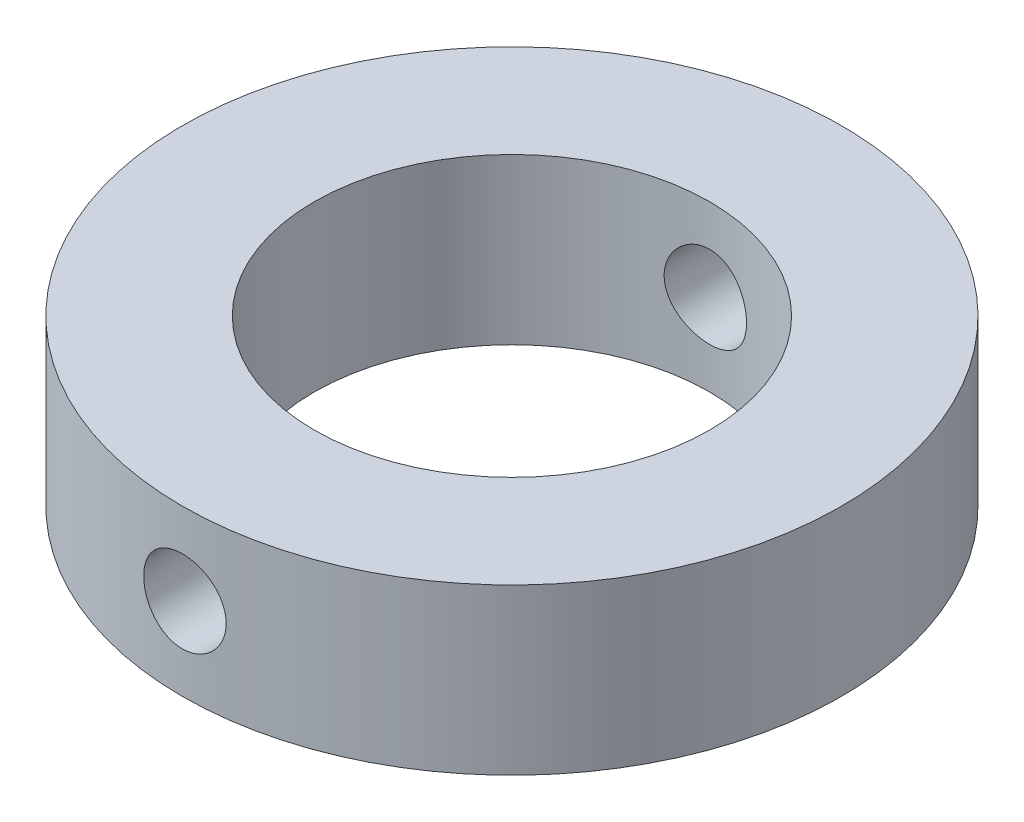
ISO-10303-21;
HEADER;
FILE_DESCRIPTION(('STEP AP214'),'2;1');
FILE_NAME('part.step','',(''),(''),'','','');
FILE_SCHEMA(('AUTOMOTIVE_DESIGN { 1 0 10303 214 1 1 1 1 }'));
ENDSEC;
DATA;
#1=APPLICATION_CONTEXT('core data for automotive mechanical design processes');
#2=APPLICATION_PROTOCOL_DEFINITION('international standard','automotive_design',2000,#1);
#3=PRODUCT_CONTEXT('',#1,'mechanical');
#4=PRODUCT('Part','Part','',(#3));
#5=PRODUCT_RELATED_PRODUCT_CATEGORY('part','',(#4));
#6=PRODUCT_DEFINITION_FORMATION('','',#4);
#7=PRODUCT_DEFINITION_CONTEXT('part definition',#1,'design');
#8=PRODUCT_DEFINITION('design','',#6,#7);
#9=PRODUCT_DEFINITION_SHAPE('','',#8);
#10=(LENGTH_UNIT() NAMED_UNIT(*) SI_UNIT(.MILLI.,.METRE.));
#11=(NAMED_UNIT(*) PLANE_ANGLE_UNIT() SI_UNIT($,.RADIAN.));
#12=(NAMED_UNIT(*) SI_UNIT($,.STERADIAN.) SOLID_ANGLE_UNIT());
#13=UNCERTAINTY_MEASURE_WITH_UNIT(LENGTH_MEASURE(1.E-05),#10,'distance_accuracy_value','');
#14=(GEOMETRIC_REPRESENTATION_CONTEXT(3) GLOBAL_UNCERTAINTY_ASSIGNED_CONTEXT((#13)) GLOBAL_UNIT_ASSIGNED_CONTEXT((#10,
#11,#12)) REPRESENTATION_CONTEXT('',''));
#15=CARTESIAN_POINT('',(0.,0.,0.));
#16=DIRECTION('',(0.,0.,1.));
#17=DIRECTION('',(1.,0.,0.));
#18=AXIS2_PLACEMENT_3D('',#15,#16,#17);
#19=CARTESIAN_POINT('',(0.,5.,0.));
#20=DIRECTION('',(0.,1.,0.));
#21=DIRECTION('',(0.,0.,1.));
#22=AXIS2_PLACEMENT_3D('',#19,#20,#21);
#23=PLANE('',#22);
#24=CARTESIAN_POINT('',(0.,5.,0.));
#25=DIRECTION('',(0.,1.,0.));
#26=DIRECTION('',(0.,0.,1.));
#27=AXIS2_PLACEMENT_3D('',#24,#25,#26);
#28=CIRCLE('',#27,10.);
#29=CARTESIAN_POINT('',(0.,5.,10.));
#30=VERTEX_POINT('',#29);
#31=EDGE_CURVE('E10',#30,#30,#28,.T.);
#32=ORIENTED_EDGE('',*,*,#31,.T.);
#33=EDGE_LOOP('',(#32));
#34=FACE_BOUND('',#33,.T.);
#35=CARTESIAN_POINT('',(0.,5.,0.));
#36=DIRECTION('',(0.,1.,0.));
#37=DIRECTION('',(0.,0.,1.));
#38=AXIS2_PLACEMENT_3D('',#35,#36,#37);
#39=CIRCLE('',#38,6.);
#40=CARTESIAN_POINT('',(0.,5.,6.));
#41=VERTEX_POINT('',#40);
#42=EDGE_CURVE('E50',#41,#41,#39,.T.);
#43=ORIENTED_EDGE('',*,*,#42,.F.);
#44=EDGE_LOOP('',(#43));
#45=FACE_BOUND('',#44,.T.);
#46=ADVANCED_FACE('F32',(#34,#45),#23,.T.);
#47=CARTESIAN_POINT('',(0.,0.,0.));
#48=DIRECTION('',(0.,1.,0.));
#49=DIRECTION('',(0.,0.,1.));
#50=AXIS2_PLACEMENT_3D('',#47,#48,#49);
#51=PLANE('',#50);
#52=CARTESIAN_POINT('',(0.,0.,0.));
#53=DIRECTION('',(0.,1.,0.));
#54=DIRECTION('',(0.,0.,1.));
#55=AXIS2_PLACEMENT_3D('',#52,#53,#54);
#56=CIRCLE('',#55,10.);
#57=CARTESIAN_POINT('',(0.,0.,10.));
#58=VERTEX_POINT('',#57);
#59=EDGE_CURVE('E45',#58,#58,#56,.T.);
#60=ORIENTED_EDGE('',*,*,#59,.F.);
#61=EDGE_LOOP('',(#60));
#62=FACE_BOUND('',#61,.T.);
#63=CARTESIAN_POINT('',(0.,0.,0.));
#64=DIRECTION('',(0.,1.,0.));
#65=DIRECTION('',(0.,0.,1.));
#66=AXIS2_PLACEMENT_3D('',#63,#64,#65);
#67=CIRCLE('',#66,6.);
#68=CARTESIAN_POINT('',(0.,0.,6.));
#69=VERTEX_POINT('',#68);
#70=EDGE_CURVE('E53',#69,#69,#67,.T.);
#71=ORIENTED_EDGE('',*,*,#70,.T.);
#72=EDGE_LOOP('',(#71));
#73=FACE_BOUND('',#72,.T.);
#74=ADVANCED_FACE('F86',(#62,#73),#51,.F.);
#75=CARTESIAN_POINT('',(0.,5.,0.));
#76=DIRECTION('',(0.,-1.,0.));
#77=DIRECTION('',(0.,0.,-1.));
#78=AXIS2_PLACEMENT_3D('',#75,#76,#77);
#79=CYLINDRICAL_SURFACE('',#78,10.);
#80=CARTESIAN_POINT('',(0.,3.75,-10.));
#81=CARTESIAN_POINT('',(-0.0699205477778807,3.74999702953214,-9.99999902448214));
#82=CARTESIAN_POINT('',(-0.139884787151374,3.74411356041536,-9.99925892277451));
#83=CARTESIAN_POINT('',(-0.277866401044876,3.7207361227146,-9.9963777005568));
#84=CARTESIAN_POINT('',(-0.345881665311872,3.70323003103831,-9.99423511720715));
#85=CARTESIAN_POINT('',(-0.477947787406527,3.65713117804296,-9.98879030522203));
#86=CARTESIAN_POINT('',(-0.542001280073069,3.62854587909507,-9.98548885727771));
#87=CARTESIAN_POINT('',(-0.664389737446518,3.5611163580151,-9.97809350439049));
#88=CARTESIAN_POINT('',(-0.722725680778185,3.52227389573464,-9.97399973542058));
#89=CARTESIAN_POINT('',(-0.832356408465658,3.4352040250802,-9.96545160653163));
#90=CARTESIAN_POINT('',(-0.883615182468563,3.38693143532688,-9.96099557346208));
#91=CARTESIAN_POINT('',(-0.977326396778747,3.28246858823168,-9.95223863004875));
#92=CARTESIAN_POINT('',(-1.01977838819613,3.22627792754338,-9.94793772762134));
#93=CARTESIAN_POINT('',(-1.09480508064197,3.10734001121717,-9.93996152809792));
#94=CARTESIAN_POINT('',(-1.12734604797054,3.04457131921603,-9.93628838588955));
#95=CARTESIAN_POINT('',(-1.18141153828756,2.91440647402632,-9.93000564228841));
#96=CARTESIAN_POINT('',(-1.20293647903261,2.84701049642649,-9.92739600056568));
#97=CARTESIAN_POINT('',(-1.23424949001238,2.70987790220662,-9.92355169801807));
#98=CARTESIAN_POINT('',(-1.24409835736585,2.6401553711479,-9.92230991718372));
#99=CARTESIAN_POINT('',(-1.25196777477861,2.50003686826408,-9.92132014071396));
#100=CARTESIAN_POINT('',(-1.24998880050121,2.42964092363435,-9.92157208500754));
#101=CARTESIAN_POINT('',(-1.23430861822395,2.29059758637561,-9.92353477684876));
#102=CARTESIAN_POINT('',(-1.22067438149235,2.22194250689987,-9.92523718980164));
#103=CARTESIAN_POINT('',(-1.18217519159103,2.08790248939051,-9.92989599878814));
#104=CARTESIAN_POINT('',(-1.15731001087595,2.02251761764298,-9.93285242022862));
#105=CARTESIAN_POINT('',(-1.09698277995582,1.89666600048916,-9.93969557932326));
#106=CARTESIAN_POINT('',(-1.06149162685382,1.83621334987551,-9.94358486605722));
#107=CARTESIAN_POINT('',(-0.980940734728459,1.72209665279338,-9.95185355715299));
#108=CARTESIAN_POINT('',(-0.935880558040388,1.66843291701316,-9.95623298392831));
#109=CARTESIAN_POINT('',(-0.83709955537689,1.56902864463863,-9.96502554945212));
#110=CARTESIAN_POINT('',(-0.783321003920006,1.52334545411701,-9.96943871193445));
#111=CARTESIAN_POINT('',(-0.668828584556961,1.44164555998473,-9.97777316277926));
#112=CARTESIAN_POINT('',(-0.608114700659126,1.405628878664,-9.98169445000753));
#113=CARTESIAN_POINT('',(-0.48143083568174,1.34428433976804,-9.9886057610929));
#114=CARTESIAN_POINT('',(-0.415459097668858,1.31896007305939,-9.99159547200768));
#115=CARTESIAN_POINT('',(-0.280153970215528,1.27976475323837,-9.99630392890031));
#116=CARTESIAN_POINT('',(-0.210820738315333,1.26589316393147,-9.99802273437935));
#117=CARTESIAN_POINT('',(-0.0712565819567485,1.25007128786972,-9.9999879820538));
#118=CARTESIAN_POINT('',(-0.00103474509930337,1.24804200381796,-10.0002441807132));
#119=CARTESIAN_POINT('',(0.138748018248748,1.25575386702797,-9.99928169002715));
#120=CARTESIAN_POINT('',(0.208308958782353,1.2654947636258,-9.99806303209106));
#121=CARTESIAN_POINT('',(0.344562253860761,1.29640485438719,-9.99429384378346));
#122=CARTESIAN_POINT('',(0.411263285212353,1.31753638170132,-9.99174770406934));
#123=CARTESIAN_POINT('',(0.540174827429204,1.37058872595646,-9.98560861550098));
#124=CARTESIAN_POINT('',(0.602385185732658,1.40250990924571,-9.98201563110312));
#125=CARTESIAN_POINT('',(0.720902260343714,1.47642656875373,-9.97415911455056));
#126=CARTESIAN_POINT('',(0.77717687997191,1.51847314490282,-9.96989222021254));
#127=CARTESIAN_POINT('',(0.881898494813159,1.6113747487671,-9.96117571162828));
#128=CARTESIAN_POINT('',(0.930345179168429,1.6622301261255,-9.95672609013449));
#129=CARTESIAN_POINT('',(1.01831597940901,1.77165370837857,-9.94811552731292));
#130=CARTESIAN_POINT('',(1.05778773028397,1.8302641731552,-9.94395637360663));
#131=CARTESIAN_POINT('',(1.12632644472175,1.95332912242736,-9.93642705518574));
#132=CARTESIAN_POINT('',(1.15539361686418,2.01778348973826,-9.93305687465513));
#133=CARTESIAN_POINT('',(1.20221328943327,2.15053765957381,-9.92749925196498));
#134=CARTESIAN_POINT('',(1.21999531372855,2.21882691502399,-9.92530872592394));
#135=CARTESIAN_POINT('',(1.24383499693392,2.35745124189033,-9.92234957953727));
#136=CARTESIAN_POINT('',(1.24989320126788,2.4277862179795,-9.92158089304388));
#137=CARTESIAN_POINT('',(1.25010326804242,2.56798446460234,-9.92155438491228));
#138=CARTESIAN_POINT('',(1.24433739884964,2.63784762416594,-9.92228612375977));
#139=CARTESIAN_POINT('',(1.22123720242466,2.77560356467254,-9.925155572686));
#140=CARTESIAN_POINT('',(1.20390287395288,2.8434963454044,-9.92729328291541));
#141=CARTESIAN_POINT('',(1.15818353684483,2.9753734783832,-9.93273057887275));
#142=CARTESIAN_POINT('',(1.12980249048547,3.03935922251091,-9.93602974796392));
#143=CARTESIAN_POINT('',(1.06280345107515,3.16167332702416,-9.9434189162241));
#144=CARTESIAN_POINT('',(1.02418532975479,3.22000161650991,-9.94750892530207));
#145=CARTESIAN_POINT('',(0.937503165632919,3.32976561267024,-9.95605302376117));
#146=CARTESIAN_POINT('',(0.889377812887479,3.38115273047749,-9.96050936042016));
#147=CARTESIAN_POINT('',(0.785175113484191,3.47515341258399,-9.9692641579645));
#148=CARTESIAN_POINT('',(0.729095894570784,3.51776490538716,-9.97356258137795));
#149=CARTESIAN_POINT('',(0.610332810427105,3.59314267855265,-9.98153528293373));
#150=CARTESIAN_POINT('',(0.547624639798084,3.62587090294963,-9.9852071253915));
#151=CARTESIAN_POINT('',(0.41759145115064,3.68028562145814,-9.99148824538362));
#152=CARTESIAN_POINT('',(0.350271540435118,3.70198411317673,-9.99409867684788));
#153=CARTESIAN_POINT('',(0.235502885983962,3.72852966908565,-9.99733360163873));
#154=CARTESIAN_POINT('',(0.18877783175846,3.73656947099103,-9.99832862947727));
#155=CARTESIAN_POINT('',(0.0947085316062171,3.74730562284661,-9.99966215664594));
#156=CARTESIAN_POINT('',(0.0473642902480135,3.75000201219965,-10.0000006608173));
#157=CARTESIAN_POINT('',(0.,3.75,-10.));
#158=B_SPLINE_CURVE_WITH_KNOTS('',3,(#80,#81,#82,#83,#84,#85,#86,#87,#88,#89,#90,#91,#92,#93,
#94,#95,#96,#97,#98,#99,#100,#101,#102,#103,#104,#105,#106,#107,#108,#109,#110,#111,#112,#113,
#114,#115,#116,#117,#118,#119,#120,#121,#122,#123,#124,#125,#126,#127,#128,#129,#130,#131,#132,
#133,#134,#135,#136,#137,#138,#139,#140,#141,#142,#143,#144,#145,#146,#147,#148,#149,#150,#151,
#152,#153,#154,#155,#156,#157),.UNSPECIFIED.,.T.,.F.,(4,2,2,2,2,2,2,2,2,2,2,2,2,2,2,2,2,2,2,2,2,
2,2,2,2,2,2,2,2,2,2,2,2,2,2,2,2,2,4),(0.,0.209588636388124,0.419396230471713,0.629062754090885,
0.838693327955366,1.04935406600922,1.26002553900005,1.47140625159435,1.68277894748403,
1.8930461264316,2.10330484942332,2.31236348220846,2.52142635083121,2.73106713142767,
2.94071750256819,3.15181739068208,3.36291776556557,3.57408897865803,3.7852503045189,
3.99500139695961,4.20474802250965,4.41380526946698,4.62286961539474,4.83301201464211,
5.04316275687544,5.25450985753787,5.4658527211077,5.67664037140463,5.88741821505312,
6.09673450601108,6.30605081939774,6.51529212353244,6.72453604956132,6.93517618845915,
7.14586599235007,7.35735701518427,7.56861749342017,7.71059421593815,7.85256989150219),.UNSPECIFIED.);
#159=CARTESIAN_POINT('',(0.,3.75,-10.));
#160=VERTEX_POINT('',#159);
#161=EDGE_CURVE('E76',#160,#160,#158,.T.);
#162=ORIENTED_EDGE('',*,*,#161,.T.);
#163=EDGE_LOOP('',(#162));
#164=FACE_BOUND('',#163,.T.);
#165=CARTESIAN_POINT('',(1.25,2.5,9.92156741649221));
#166=CARTESIAN_POINT('',(1.24999702741697,2.43008185810409,9.92156842085664));
#167=CARTESIAN_POINT('',(1.24411394951064,2.36012001754759,9.92231447559473));
#168=CARTESIAN_POINT('',(1.22073820686067,2.2221433872977,9.92521695489986));
#169=CARTESIAN_POINT('',(1.20323341054565,2.15413070975148,9.92737485321481));
#170=CARTESIAN_POINT('',(1.15713834641298,2.02207005894198,9.93285286887713));
#171=CARTESIAN_POINT('',(1.12855560239912,1.95801942894067,9.93617219726825));
#172=CARTESIAN_POINT('',(1.06113209921476,1.83563577408846,9.94359811759954));
#173=CARTESIAN_POINT('',(1.0222930936874,1.77730177412847,9.94770457492142));
#174=CARTESIAN_POINT('',(0.935226725132209,1.66766887643894,9.9562677962195));
#175=CARTESIAN_POINT('',(0.886953407512148,1.61640659884056,9.96072620851022));
#176=CARTESIAN_POINT('',(0.782487630335614,1.52268861553046,9.96947616437916));
#177=CARTESIAN_POINT('',(0.726294777029017,1.48023334795265,9.97376769964692));
#178=CARTESIAN_POINT('',(0.607354915337986,1.40520321024682,9.98171722306411));
#179=CARTESIAN_POINT('',(0.544586847780557,1.37266147745017,9.98537306923403));
#180=CARTESIAN_POINT('',(0.414423359027958,1.31859440002952,9.99162118477263));
#181=CARTESIAN_POINT('',(0.347028109680452,1.29706864653674,9.99421349361484));
#182=CARTESIAN_POINT('',(0.209897843875556,1.26575396583279,9.99803084353114));
#183=CARTESIAN_POINT('',(0.140176929831689,1.25590416073805,9.9992629741797));
#184=CARTESIAN_POINT('',(6.16003432731118E-05,1.24803230748173,10.0002453486461));
#185=CARTESIAN_POINT('',(-0.0703327884973858,1.25000979402373,9.99999565076039));
#186=CARTESIAN_POINT('',(-0.209382634487274,1.26568760137871,9.99804823885005));
#187=CARTESIAN_POINT('',(-0.278045602882227,1.27932244924069,9.99635861227864));
#188=CARTESIAN_POINT('',(-0.412101081952688,1.31782558831497,9.99173027971167));
#189=CARTESIAN_POINT('',(-0.477493530428103,1.34269409308341,9.98879154997023));
#190=CARTESIAN_POINT('',(-0.60335440771932,1.40302824639189,9.98198128903956));
#191=CARTESIAN_POINT('',(-0.66380911392026,1.43852222886509,9.97810726921619));
#192=CARTESIAN_POINT('',(-0.777928726153239,1.51907918110801,9.96985984532641));
#193=CARTESIAN_POINT('',(-0.831593320608679,1.56414258973429,9.96548641836132));
#194=CARTESIAN_POINT('',(-0.930994015386473,1.66292590929919,9.95669433761757));
#195=CARTESIAN_POINT('',(-0.976673419997999,1.71670287977333,9.95227557902364));
#196=CARTESIAN_POINT('',(-1.05836642531255,1.83119077839123,9.9439203597029));
#197=CARTESIAN_POINT('',(-1.09437999571755,1.89190172826903,9.9399839004879));
#198=CARTESIAN_POINT('',(-1.15572228679137,2.01858474778116,9.93303901306359));
#199=CARTESIAN_POINT('',(-1.18104646493116,2.0845590399766,9.93003097954065));
#200=CARTESIAN_POINT('',(-1.22024082723404,2.21986972676342,9.92529121247978));
#201=CARTESIAN_POINT('',(-1.23411156339981,2.28920595915436,9.92355941743351));
#202=CARTESIAN_POINT('',(-1.24993021595431,2.42877159099988,9.92157944392025));
#203=CARTESIAN_POINT('',(-1.25195792099914,2.4989918115444,9.92132133721188));
#204=CARTESIAN_POINT('',(-1.24424347661528,2.63877096483271,9.92229170559824));
#205=CARTESIAN_POINT('',(-1.2345015780549,2.70832991163966,9.92352014900725));
#206=CARTESIAN_POINT('',(-1.20359164289886,2.84457288178893,9.92731614241993));
#207=CARTESIAN_POINT('',(-1.18246224187303,2.9112658075952,9.92987916347331));
#208=CARTESIAN_POINT('',(-1.12941685955806,3.04016207742658,9.93605184985404));
#209=CARTESIAN_POINT('',(-1.09750049929061,3.10236526362044,9.93966155195382));
#210=CARTESIAN_POINT('',(-1.02359101107746,3.2208773219065,9.94754465676617));
#211=CARTESIAN_POINT('',(-0.981545559788553,3.27715333265721,9.95182146368541));
#212=CARTESIAN_POINT('',(-0.888645371184478,3.38187827696752,9.96054619775512));
#213=CARTESIAN_POINT('',(-0.837790291212742,3.43032690593399,9.96499413155644));
#214=CARTESIAN_POINT('',(-0.728365887779261,3.5183020936672,9.9735904434348));
#215=CARTESIAN_POINT('',(-0.669754246058517,3.5577762233975,9.97773696956261));
#216=CARTESIAN_POINT('',(-0.546686290840894,3.6263191088169,9.98523556515805));
#217=CARTESIAN_POINT('',(-0.482230095184161,3.65538807424049,9.98858765063858));
#218=CARTESIAN_POINT('',(-0.349476929569727,3.70220889345402,9.99411145326594));
#219=CARTESIAN_POINT('',(-0.281190783255889,3.71999104801581,9.99628632843852));
#220=CARTESIAN_POINT('',(-0.142573028638979,3.74383204461338,9.99922377338782));
#221=CARTESIAN_POINT('',(-0.0722415127190529,3.74989141529962,9.99998640685089));
#222=CARTESIAN_POINT('',(0.0679585916718927,3.75010496114608,10.0000131400683));
#223=CARTESIAN_POINT('',(0.137827068857368,3.74433998028399,9.9992874158392));
#224=CARTESIAN_POINT('',(0.275593870726307,3.72123969328458,9.99643920578969));
#225=CARTESIAN_POINT('',(0.343492196779925,3.70390439519412,9.99431672094073));
#226=CARTESIAN_POINT('',(0.475380721493659,3.65818094282515,9.98891242606016));
#227=CARTESIAN_POINT('',(0.539372280079787,3.62979666031339,9.98563102217235));
#228=CARTESIAN_POINT('',(0.661696668572013,3.56278934269622,9.9782722380314));
#229=CARTESIAN_POINT('',(0.720029431194016,3.52416618586915,9.97419484831559));
#230=CARTESIAN_POINT('',(0.829793383981279,3.43747839233181,9.96566596962789));
#231=CARTESIAN_POINT('',(0.88117689391715,3.38935360323817,9.9612122063946));
#232=CARTESIAN_POINT('',(0.975170559409673,3.28515352798557,9.95245079506771));
#233=CARTESIAN_POINT('',(1.01777863389675,3.22907636125455,9.94814318183499));
#234=CARTESIAN_POINT('',(1.09315262125802,3.11031503865132,9.94014405697344));
#235=CARTESIAN_POINT('',(1.12587989158337,3.04760620503246,9.93645498876141));
#236=CARTESIAN_POINT('',(1.18029264417168,2.91757162970262,9.93013929059811));
#237=CARTESIAN_POINT('',(1.20199013561416,2.8502510003483,9.92751150576939));
#238=CARTESIAN_POINT('',(1.22853294811899,2.73548500647823,9.92425393409921));
#239=CARTESIAN_POINT('',(1.23657151550529,2.68876352423121,9.92325150760955));
#240=CARTESIAN_POINT('',(1.24730602795276,2.59470137501654,9.92190791114956));
#241=CARTESIAN_POINT('',(1.25000201354966,2.54736071274952,9.92156673616213));
#242=CARTESIAN_POINT('',(1.25,2.5,9.92156741649221));
#243=B_SPLINE_CURVE_WITH_KNOTS('',3,(#165,#166,#167,#168,#169,#170,#171,#172,#173,#174,#175,
#176,#177,#178,#179,#180,#181,#182,#183,#184,#185,#186,#187,#188,#189,#190,#191,#192,#193,#194,
#195,#196,#197,#198,#199,#200,#201,#202,#203,#204,#205,#206,#207,#208,#209,#210,#211,#212,#213,
#214,#215,#216,#217,#218,#219,#220,#221,#222,#223,#224,#225,#226,#227,#228,#229,#230,#231,#232,
#233,#234,#235,#236,#237,#238,#239,#240,#241,#242),.UNSPECIFIED.,.T.,.F.,(4,2,2,2,2,2,2,2,2,2,2,
2,2,2,2,2,2,2,2,2,2,2,2,2,2,2,2,2,2,2,2,2,2,2,2,2,2,2,4),(0.,0.209581408739619,
0.419381938076191,0.629040226290601,0.838662689753064,1.04933288774533,1.2600135637129,
1.4713909307287,1.68276045169915,1.89302298470729,2.10327724585054,2.31235832466519,
2.52144337835895,2.73109102206402,2.94074828234553,3.15183848688885,3.36292935309713,
3.57410983369505,3.78528013578094,3.99502608902942,4.20476757163558,4.41380188146367,
4.62284353605927,4.83298909772056,5.04314283497406,5.25449442946171,5.46584176354439,
5.67661928392471,5.88738729886406,6.09671908144128,6.30605071843395,6.51530906772045,
6.72456990482124,6.93520064445418,7.14588127719915,7.35737548852417,7.56863892991008,
7.71060494816475,7.85256988927737),.UNSPECIFIED.);
#244=CARTESIAN_POINT('',(1.25,2.5,9.92156741649221));
#245=VERTEX_POINT('',#244);
#246=EDGE_CURVE('E72',#245,#245,#243,.T.);
#247=ORIENTED_EDGE('',*,*,#246,.T.);
#248=EDGE_LOOP('',(#247));
#249=FACE_BOUND('',#248,.T.);
#250=ORIENTED_EDGE('',*,*,#31,.F.);
#251=EDGE_LOOP('',(#250));
#252=FACE_BOUND('',#251,.T.);
#253=ORIENTED_EDGE('',*,*,#59,.T.);
#254=EDGE_LOOP('',(#253));
#255=FACE_BOUND('',#254,.T.);
#256=ADVANCED_FACE('F34',(#164,#249,#252,#255),#79,.T.);
#257=CARTESIAN_POINT('',(0.,5.,0.));
#258=DIRECTION('',(0.,-1.,0.));
#259=DIRECTION('',(0.,0.,-1.));
#260=AXIS2_PLACEMENT_3D('',#257,#258,#259);
#261=CYLINDRICAL_SURFACE('',#260,6.);
#262=CARTESIAN_POINT('',(0.,3.75,-6.));
#263=CARTESIAN_POINT('',(-0.0694090417016607,3.74999752253078,-5.99999871526651));
#264=CARTESIAN_POINT('',(-0.138848789520876,3.74419933428125,-5.99878328775043));
#265=CARTESIAN_POINT('',(-0.275761316266993,3.72118065046715,-5.9940520099068));
#266=CARTESIAN_POINT('',(-0.343232560128313,3.70395147696307,-5.99053441189248));
#267=CARTESIAN_POINT('',(-0.474209132291342,3.65862954507818,-5.98159109196202));
#268=CARTESIAN_POINT('',(-0.537718336709185,3.63054760400111,-5.97616727052645));
#269=CARTESIAN_POINT('',(-0.659120328605959,3.56435039114382,-5.96399927809859));
#270=CARTESIAN_POINT('',(-0.717013367534327,3.52623556884417,-5.95725516625975));
#271=CARTESIAN_POINT('',(-0.826390324308837,3.44046365980936,-5.9430770002465));
#272=CARTESIAN_POINT('',(-0.877780244162685,3.39268799876492,-5.93563505848531));
#273=CARTESIAN_POINT('',(-0.971877776769393,3.28920534080489,-5.92095657692448));
#274=CARTESIAN_POINT('',(-1.01458467096099,3.23349768812774,-5.91372005416683));
#275=CARTESIAN_POINT('',(-1.09051031677217,3.11504803123384,-5.90019442595308));
#276=CARTESIAN_POINT('',(-1.12363054680651,3.05224161549726,-5.89391545174828));
#277=CARTESIAN_POINT('',(-1.17881119348064,2.92180254822724,-5.8831284065002));
#278=CARTESIAN_POINT('',(-1.20087280167641,2.85417041755746,-5.87862014467568));
#279=CARTESIAN_POINT('',(-1.23300240133737,2.71701476258436,-5.87196500986123));
#280=CARTESIAN_POINT('',(-1.24323597696799,2.64753164066523,-5.86978556855865));
#281=CARTESIAN_POINT('',(-1.25193357655615,2.50780315713737,-5.86793690716491));
#282=CARTESIAN_POINT('',(-1.25039890894687,2.4375578811347,-5.86826740800981));
#283=CARTESIAN_POINT('',(-1.23573719037197,2.29951897202482,-5.87137174319175));
#284=CARTESIAN_POINT('',(-1.2228010523272,2.23170402033879,-5.87410533679901));
#285=CARTESIAN_POINT('',(-1.18600543529945,2.09922849035507,-5.88164437615942));
#286=CARTESIAN_POINT('',(-1.16214539481382,2.03456807439367,-5.88644992841317));
#287=CARTESIAN_POINT('',(-1.10400003213928,1.90969277158402,-5.89763191464102));
#288=CARTESIAN_POINT('',(-1.06964002534237,1.84951370347293,-5.90401953785586));
#289=CARTESIAN_POINT('',(-0.991522699274819,1.73570425573184,-5.91763890010721));
#290=CARTESIAN_POINT('',(-0.947764212262588,1.68207469116402,-5.92487074398537));
#291=CARTESIAN_POINT('',(-0.851074921546783,1.58178603891963,-5.93953730929909));
#292=CARTESIAN_POINT('',(-0.797981433412083,1.53528383110299,-5.94697323199473));
#293=CARTESIAN_POINT('',(-0.684667288611798,1.45181955777103,-5.96108088143001));
#294=CARTESIAN_POINT('',(-0.624446525025766,1.4148576354016,-5.96775259670236));
#295=CARTESIAN_POINT('',(-0.498405541235478,1.35148991846405,-5.97959870942815));
#296=CARTESIAN_POINT('',(-0.4325754619265,1.32510319543288,-5.98477039710258));
#297=CARTESIAN_POINT('',(-0.297284620972155,1.28380829516451,-5.99301338211281));
#298=CARTESIAN_POINT('',(-0.227824338595089,1.2688986067686,-5.99608495596053));
#299=CARTESIAN_POINT('',(-0.088591865700835,1.25120574793211,-5.99974275215456));
#300=CARTESIAN_POINT('',(-0.0188480555261783,1.24820805850575,-6.00037293537579));
#301=CARTESIAN_POINT('',(0.120143798757715,1.2538449499691,-5.99919952252774));
#302=CARTESIAN_POINT('',(0.189391872962258,1.2624788186016,-5.99739607548153));
#303=CARTESIAN_POINT('',(0.324726367119813,1.29095565346953,-5.99158564979184));
#304=CARTESIAN_POINT('',(0.390837192894206,1.31068748538347,-5.98760052868077));
#305=CARTESIAN_POINT('',(0.518811446661331,1.36067786042141,-5.97787227242395));
#306=CARTESIAN_POINT('',(0.580674536336775,1.39093724086598,-5.97212899744579));
#307=CARTESIAN_POINT('',(0.699294306943494,1.46158037823756,-5.95941241490714));
#308=CARTESIAN_POINT('',(0.755973219469835,1.50209192956906,-5.9524239381233));
#309=CARTESIAN_POINT('',(0.86180544588652,1.59191956307627,-5.93802568299709));
#310=CARTESIAN_POINT('',(0.910957877913286,1.64123667551894,-5.93061585542511));
#311=CARTESIAN_POINT('',(1.0011786486518,1.7482555769997,-5.91606024531377));
#312=CARTESIAN_POINT('',(1.04209914600204,1.80608303195528,-5.90892089307501));
#313=CARTESIAN_POINT('',(1.11364719079244,1.92791628421379,-5.89585601015805));
#314=CARTESIAN_POINT('',(1.14427516677864,1.9919218241391,-5.88993042894651));
#315=CARTESIAN_POINT('',(1.19417246443922,2.12396119629823,-5.88001700708041));
#316=CARTESIAN_POINT('',(1.21350309828032,2.19197103716584,-5.87601872784687));
#317=CARTESIAN_POINT('',(1.24044038523407,2.33036655049226,-5.87039184709697));
#318=CARTESIAN_POINT('',(1.24804871544441,2.40075188161944,-5.86876290660367));
#319=CARTESIAN_POINT('',(1.25125926487611,2.54041340099965,-5.86807907308506));
#320=CARTESIAN_POINT('',(1.24709542622725,2.60968407022205,-5.86897402321502));
#321=CARTESIAN_POINT('',(1.22739905314032,2.74651400892022,-5.87312447254927));
#322=CARTESIAN_POINT('',(1.21186662782266,2.81407329481611,-5.87637994909626));
#323=CARTESIAN_POINT('',(1.16998217768585,2.94539777189066,-5.88486132447716));
#324=CARTESIAN_POINT('',(1.14366117568421,3.00917324648693,-5.8900815700793));
#325=CARTESIAN_POINT('',(1.08097457299757,3.13143877602667,-5.90190705738738));
#326=CARTESIAN_POINT('',(1.0446080398303,3.18992833963313,-5.9085124276546));
#327=CARTESIAN_POINT('',(0.962073695342411,3.30112162707945,-5.92251579551146));
#328=CARTESIAN_POINT('',(0.915737890418226,3.35369912456498,-5.92992613868404));
#329=CARTESIAN_POINT('',(0.814924438115335,3.45040949322636,-5.94461839583213));
#330=CARTESIAN_POINT('',(0.760444918832968,3.49454041755149,-5.9519002798488));
#331=CARTESIAN_POINT('',(0.644134427507704,3.57358857318406,-5.96561444547638));
#332=CARTESIAN_POINT('',(0.582225921521349,3.60839367988629,-5.97203596073244));
#333=CARTESIAN_POINT('',(0.453319843998455,3.66705022843002,-5.98319908494092));
#334=CARTESIAN_POINT('',(0.386326781907245,3.69091124718188,-5.98794216182101));
#335=CARTESIAN_POINT('',(0.266015292900106,3.72254027828842,-5.99432499781443));
#336=CARTESIAN_POINT('',(0.213367593727929,3.73281876320886,-5.99644035661395));
#337=CARTESIAN_POINT('',(0.107152674176537,3.74654945427733,-5.99927832789758));
#338=CARTESIAN_POINT('',(0.053585487848872,3.75000191266719,-6.00000099184586));
#339=CARTESIAN_POINT('',(0.,3.75,-6.));
#340=B_SPLINE_CURVE_WITH_KNOTS('',3,(#262,#263,#264,#265,#266,#267,#268,#269,#270,#271,#272,
#273,#274,#275,#276,#277,#278,#279,#280,#281,#282,#283,#284,#285,#286,#287,#288,#289,#290,#291,
#292,#293,#294,#295,#296,#297,#298,#299,#300,#301,#302,#303,#304,#305,#306,#307,#308,#309,#310,
#311,#312,#313,#314,#315,#316,#317,#318,#319,#320,#321,#322,#323,#324,#325,#326,#327,#328,#329,
#330,#331,#332,#333,#334,#335,#336,#337,#338,#339),.UNSPECIFIED.,.T.,.F.,(4,2,2,2,2,2,2,2,2,2,2,
2,2,2,2,2,2,2,2,2,2,2,2,2,2,2,2,2,2,2,2,2,2,2,2,2,2,2,4),(0.,0.208031045103183,
0.416220199906225,0.624202378825443,0.83217524157299,1.04287526388123,1.25359271551786,
1.46640449178549,1.6791933328549,1.88896575169854,2.09871484767165,2.3050171212906,
2.5113300003028,2.71914592416749,2.92698768368035,3.13889526355466,3.35080602278218,
3.56309724499663,3.77536051045772,3.98378339407676,4.19219351552278,4.39855286632622,
4.60492863390933,4.81401583995737,5.02312752564574,5.23571263829337,5.4482888985131,
5.65970050095025,5.87108185414185,6.07829223291039,6.28550062281362,6.49211731393256,
6.69875319081481,6.9091902483031,7.1196757511737,7.33258864398257,7.54531486464974,
7.7059258847728,7.86653096973392),.UNSPECIFIED.);
#341=CARTESIAN_POINT('',(0.,3.75,-6.));
#342=VERTEX_POINT('',#341);
#343=EDGE_CURVE('E37',#342,#342,#340,.T.);
#344=ORIENTED_EDGE('',*,*,#343,.F.);
#345=EDGE_LOOP('',(#344));
#346=FACE_BOUND('',#345,.T.);
#347=CARTESIAN_POINT('',(1.25,2.5,5.86834729715275));
#348=CARTESIAN_POINT('',(1.249997508776,2.43060938484897,5.86834869213645));
#349=CARTESIAN_POINT('',(1.24420229433948,2.36118802798478,5.86959145924544));
#350=CARTESIAN_POINT('',(1.22119649233779,2.22431368268275,5.87442015581798));
#351=CARTESIAN_POINT('',(1.20397715440342,2.15686224449358,5.87800788138388));
#352=CARTESIAN_POINT('',(1.1586839750723,2.02592762716513,5.8871029296193));
#353=CARTESIAN_POINT('',(1.13062141248932,1.9624404040082,5.89260825706945));
#354=CARTESIAN_POINT('',(1.06446988601732,1.8410755003544,5.90491581335741));
#355=CARTESIAN_POINT('',(1.0263813273582,1.78319759326998,5.91171798977622));
#356=CARTESIAN_POINT('',(0.940636399466084,1.67380462484654,5.92596934661468));
#357=CARTESIAN_POINT('',(0.89285555486967,1.62238810637353,5.93342614373039));
#358=CARTESIAN_POINT('',(0.789351223880637,1.5282389313519,5.94807966802575));
#359=CARTESIAN_POINT('',(0.733627155456003,1.48550691170856,5.95527637609915));
#360=CARTESIAN_POINT('',(0.615162052999589,1.40955411191714,5.96868135118848));
#361=CARTESIAN_POINT('',(0.552359428204942,1.37642747353674,5.97487958631243));
#362=CARTESIAN_POINT('',(0.42192855100672,1.32123394714022,5.98550347343303));
#363=CARTESIAN_POINT('',(0.354300789950592,1.29916593484647,5.98992930561223));
#364=CARTESIAN_POINT('',(0.217162904200503,1.26702423888253,5.99645589892179));
#365=CARTESIAN_POINT('',(0.147693380916358,1.25678398280483,5.99858891959926));
#366=CARTESIAN_POINT('',(0.00799184883952445,1.24806830424298,6.00040112580612));
#367=CARTESIAN_POINT('',(-0.0622400797368386,1.2495916558069,6.0000805670369));
#368=CARTESIAN_POINT('',(-0.200326586199572,1.26423460095674,5.99704658090511));
#369=CARTESIAN_POINT('',(-0.268201128726475,1.27717471895812,5.99437018956584));
#370=CARTESIAN_POINT('',(-0.400793746289753,1.3139986253313,5.98696720898885));
#371=CARTESIAN_POINT('',(-0.465511687511022,1.33788287720308,5.98224053291904));
#372=CARTESIAN_POINT('',(-0.590460005384684,1.3960800521255,5.97120767323924));
#373=CARTESIAN_POINT('',(-0.650657134981651,1.43046229420966,5.96489104125346));
#374=CARTESIAN_POINT('',(-0.764493456510649,1.50862800284041,5.95137300440189));
#375=CARTESIAN_POINT('',(-0.81813183181642,1.55241263820613,5.94417148958325));
#376=CARTESIAN_POINT('',(-0.918394203276913,1.64912162489105,5.92951700233276));
#377=CARTESIAN_POINT('',(-0.964866487494795,1.70220305998194,5.92206184975925));
#378=CARTESIAN_POINT('',(-1.04827597240488,1.8154820489948,5.90786872648996));
#379=CARTESIAN_POINT('',(-1.0852129606998,1.87567976138723,5.9011307717716));
#380=CARTESIAN_POINT('',(-1.14856217138454,2.0017122548288,5.88912998409156));
#381=CARTESIAN_POINT('',(-1.17494805489727,2.06756065069343,5.88387085232125));
#382=CARTESIAN_POINT('',(-1.21623577538673,2.20289161936938,5.8754760641036));
#383=CARTESIAN_POINT('',(-1.23113924882349,2.27237367280809,5.87234010507182));
#384=CARTESIAN_POINT('',(-1.24880863867017,2.41161970631891,5.86860783239132));
#385=CARTESIAN_POINT('',(-1.25179442917998,2.48135458453703,5.86796551863474));
#386=CARTESIAN_POINT('',(-1.24613693439294,2.62032581154014,5.86916952018704));
#387=CARTESIAN_POINT('',(-1.23749436857863,2.68956219090233,5.87101568152623));
#388=CARTESIAN_POINT('',(-1.20901558325484,2.82482051605812,5.87694538226166));
#389=CARTESIAN_POINT('',(-1.18929841376871,2.89086866717883,5.88100511282997));
#390=CARTESIAN_POINT('',(-1.13935810860919,3.0187239894416,5.8908833850312));
#391=CARTESIAN_POINT('',(-1.10913404556146,3.0805307856504,5.89670208191057));
#392=CARTESIAN_POINT('',(-1.03854598181485,3.19910644121623,5.90954501937191));
#393=CARTESIAN_POINT('',(-0.998045327353963,3.25579220446617,5.91658506648323));
#394=CARTESIAN_POINT('',(-0.90823444056988,3.36164324915506,5.93103483993908));
#395=CARTESIAN_POINT('',(-0.858923220505174,3.41080768623923,5.93844460766532));
#396=CARTESIAN_POINT('',(-0.75190045084334,3.50106271309716,5.95294924316736));
#397=CARTESIAN_POINT('',(-0.694061907614553,3.54200409502638,5.9600367471991));
#398=CARTESIAN_POINT('',(-0.572200102216361,3.61358875208798,5.97296708772407));
#399=CARTESIAN_POINT('',(-0.508177113476883,3.64423248223745,5.97880997920818));
#400=CARTESIAN_POINT('',(-0.37614211784792,3.69413867931735,5.98856148270679));
#401=CARTESIAN_POINT('',(-0.308156710970196,3.71346916554434,5.99248163136497));
#402=CARTESIAN_POINT('',(-0.169813400503473,3.7404144040081,5.99799561410226));
#403=CARTESIAN_POINT('',(-0.0994558094616962,3.74803069353274,5.99958975342889));
#404=CARTESIAN_POINT('',(0.0402133434703385,3.75126762204851,6.00026408056941));
#405=CARTESIAN_POINT('',(0.109519592177921,3.74711189999473,5.99939113754811));
#406=CARTESIAN_POINT('',(0.246422870373552,3.72741936134707,5.99532874094472));
#407=CARTESIAN_POINT('',(0.314019925202702,3.71188271359323,5.99213932172839));
#408=CARTESIAN_POINT('',(0.445431965492052,3.66997220535144,5.98380460077544));
#409=CARTESIAN_POINT('',(0.509256550004523,3.6436273361469,5.97866453407556));
#410=CARTESIAN_POINT('',(0.631610567220741,3.580877602268,5.96697995347704));
#411=CARTESIAN_POINT('',(0.690139538279511,3.54447186165686,5.96043531730246));
#412=CARTESIAN_POINT('',(0.801340321298261,3.4618903320067,5.94651596786386));
#413=CARTESIAN_POINT('',(0.853892633615927,3.4155557119433,5.93912880302851));
#414=CARTESIAN_POINT('',(0.950552741980386,3.31475549900292,5.9244278681135));
#415=CARTESIAN_POINT('',(0.994658521571233,3.26028797005157,5.91711411595368));
#416=CARTESIAN_POINT('',(1.07367451852767,3.14399089756656,5.90329191643327));
#417=CARTESIAN_POINT('',(1.10846928126994,3.0820815885379,5.89679406702551));
#418=CARTESIAN_POINT('',(1.16710627925306,2.95317484391673,5.88547039658063));
#419=CARTESIAN_POINT('',(1.1909581629246,2.88618195154699,5.88064310352601));
#420=CARTESIAN_POINT('',(1.22256554131861,2.76589371843157,5.87414004405196));
#421=CARTESIAN_POINT('',(1.2328344900567,2.71327046340695,5.87198163591589));
#422=CARTESIAN_POINT('',(1.24655254358404,2.60710421947899,5.86908475266778));
#423=CARTESIAN_POINT('',(1.25000192292741,2.55356126768996,5.86834622039193));
#424=CARTESIAN_POINT('',(1.25,2.5,5.86834729715275));
#425=B_SPLINE_CURVE_WITH_KNOTS('',3,(#347,#348,#349,#350,#351,#352,#353,#354,#355,#356,#357,
#358,#359,#360,#361,#362,#363,#364,#365,#366,#367,#368,#369,#370,#371,#372,#373,#374,#375,#376,
#377,#378,#379,#380,#381,#382,#383,#384,#385,#386,#387,#388,#389,#390,#391,#392,#393,#394,#395,
#396,#397,#398,#399,#400,#401,#402,#403,#404,#405,#406,#407,#408,#409,#410,#411,#412,#413,#414,
#415,#416,#417,#418,#419,#420,#421,#422,#423,#424),.UNSPECIFIED.,.T.,.F.,(4,2,2,2,2,2,2,2,2,2,2,
2,2,2,2,2,2,2,2,2,2,2,2,2,2,2,2,2,2,2,2,2,2,2,2,2,2,2,4),(0.,0.20797565407127,0.416110792417471,
0.62403001480273,0.831940834815791,1.04271333467885,1.25350128663874,1.46629026266844,
1.67905760106933,1.88879048859265,2.09850151896339,2.30497341416461,2.51145405455871,
2.7193287197795,2.9272292410426,3.13905862244914,3.35089272191628,3.56325237332488,
3.77558175387597,3.98397516009792,4.19235567296524,4.39853786231923,4.60473825464031,
4.81383917934651,5.02296356082186,5.23559458753344,5.44821621759041,5.65954599648535,
5.87084803959582,6.07816293922645,6.28547476332982,6.49223410585101,6.69901145528174,
6.90938318978574,7.11980508427536,7.33272651358124,7.54545984571989,7.7059986758577,
7.86653104261162),.UNSPECIFIED.);
#426=CARTESIAN_POINT('',(1.25,2.5,5.86834729715275));
#427=VERTEX_POINT('',#426);
#428=EDGE_CURVE('E55',#427,#427,#425,.T.);
#429=ORIENTED_EDGE('',*,*,#428,.F.);
#430=EDGE_LOOP('',(#429));
#431=FACE_BOUND('',#430,.T.);
#432=ORIENTED_EDGE('',*,*,#42,.T.);
#433=EDGE_LOOP('',(#432));
#434=FACE_BOUND('',#433,.T.);
#435=ORIENTED_EDGE('',*,*,#70,.F.);
#436=EDGE_LOOP('',(#435));
#437=FACE_BOUND('',#436,.T.);
#438=ADVANCED_FACE('F59',(#346,#431,#434,#437),#261,.F.);
#439=CARTESIAN_POINT('',(0.,2.5,-10.));
#440=DIRECTION('',(0.,0.,1.));
#441=DIRECTION('',(1.,0.,0.));
#442=AXIS2_PLACEMENT_3D('',#439,#440,#441);
#443=CYLINDRICAL_SURFACE('',#442,1.25);
#444=ORIENTED_EDGE('',*,*,#428,.T.);
#445=EDGE_LOOP('',(#444));
#446=FACE_BOUND('',#445,.T.);
#447=ORIENTED_EDGE('',*,*,#246,.F.);
#448=EDGE_LOOP('',(#447));
#449=FACE_BOUND('',#448,.T.);
#450=ADVANCED_FACE('F65',(#446,#449),#443,.F.);
#451=ORIENTED_EDGE('',*,*,#343,.T.);
#452=EDGE_LOOP('',(#451));
#453=FACE_BOUND('',#452,.T.);
#454=ORIENTED_EDGE('',*,*,#161,.F.);
#455=EDGE_LOOP('',(#454));
#456=FACE_BOUND('',#455,.T.);
#457=ADVANCED_FACE('F62',(#453,#456),#443,.F.);
#458=CLOSED_SHELL('',(#46,#74,#256,#438,#450,#457));
#459=MANIFOLD_SOLID_BREP('B2',#458);
#460=ADVANCED_BREP_SHAPE_REPRESENTATION('',(#18,#459),#14);
#461=SHAPE_DEFINITION_REPRESENTATION(#9,#460);
ENDSEC;
END-ISO-10303-21;
